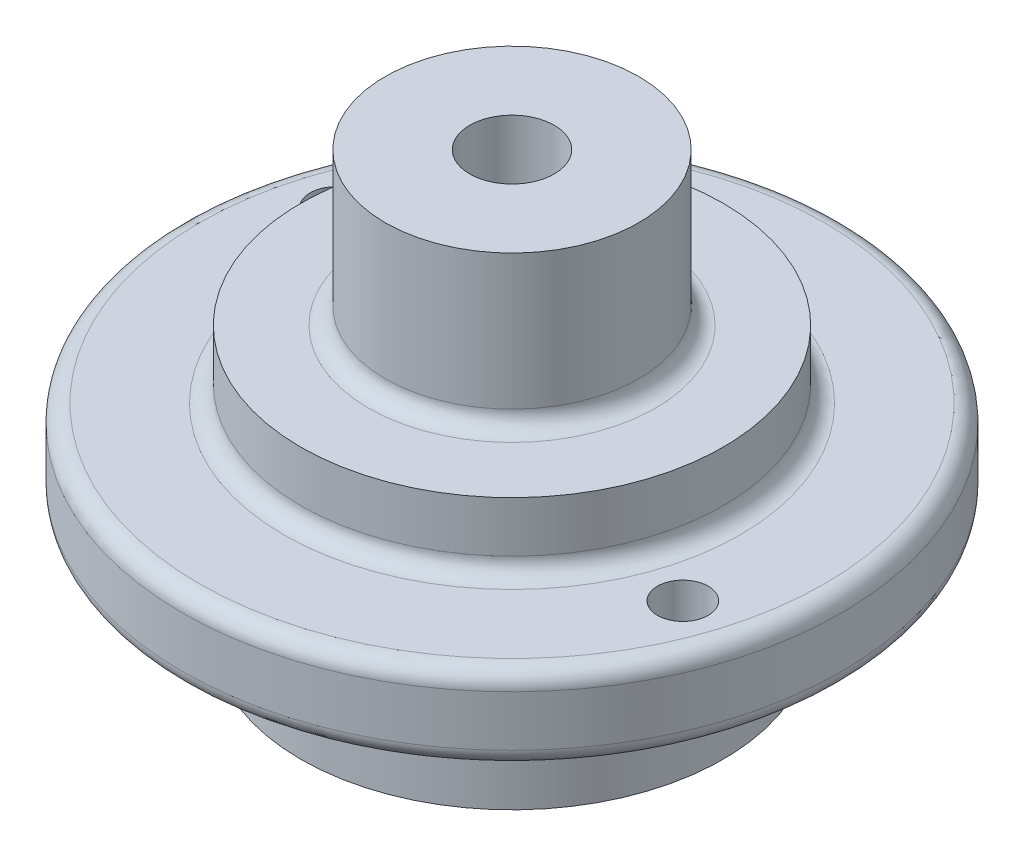
ISO-10303-21;
HEADER;
FILE_DESCRIPTION(('STEP AP214'),'2;1');
FILE_NAME('part.step','',(''),(''),'','','');
FILE_SCHEMA(('AUTOMOTIVE_DESIGN { 1 0 10303 214 1 1 1 1 }'));
ENDSEC;
DATA;
#1=APPLICATION_CONTEXT('core data for automotive mechanical design processes');
#2=APPLICATION_PROTOCOL_DEFINITION('international standard','automotive_design',2000,#1);
#3=PRODUCT_CONTEXT('',#1,'mechanical');
#4=PRODUCT('Part','Part','',(#3));
#5=PRODUCT_RELATED_PRODUCT_CATEGORY('part','',(#4));
#6=PRODUCT_DEFINITION_FORMATION('','',#4);
#7=PRODUCT_DEFINITION_CONTEXT('part definition',#1,'design');
#8=PRODUCT_DEFINITION('design','',#6,#7);
#9=PRODUCT_DEFINITION_SHAPE('','',#8);
#10=(LENGTH_UNIT() NAMED_UNIT(*) SI_UNIT(.MILLI.,.METRE.));
#11=(NAMED_UNIT(*) PLANE_ANGLE_UNIT() SI_UNIT($,.RADIAN.));
#12=(NAMED_UNIT(*) SI_UNIT($,.STERADIAN.) SOLID_ANGLE_UNIT());
#13=UNCERTAINTY_MEASURE_WITH_UNIT(LENGTH_MEASURE(1.E-05),#10,'distance_accuracy_value','');
#14=(GEOMETRIC_REPRESENTATION_CONTEXT(3) GLOBAL_UNCERTAINTY_ASSIGNED_CONTEXT((#13)) GLOBAL_UNIT_ASSIGNED_CONTEXT((#10,
#11,#12)) REPRESENTATION_CONTEXT('',''));
#15=CARTESIAN_POINT('',(0.,0.,0.));
#16=DIRECTION('',(0.,0.,1.));
#17=DIRECTION('',(1.,0.,0.));
#18=AXIS2_PLACEMENT_3D('',#15,#16,#17);
#19=CARTESIAN_POINT('',(0.,43.2272727272726,7.5));
#20=DIRECTION('',(0.,1.,0.));
#21=DIRECTION('',(0.,0.,1.));
#22=AXIS2_PLACEMENT_3D('',#19,#20,#21);
#23=PLANE('',#22);
#24=CARTESIAN_POINT('',(0.,43.2272727272726,0.));
#25=DIRECTION('',(0.,1.,0.));
#26=DIRECTION('',(0.,0.,1.));
#27=AXIS2_PLACEMENT_3D('',#24,#25,#26);
#28=CIRCLE('',#27,7.5);
#29=CARTESIAN_POINT('',(0.,43.2272727272726,7.5));
#30=VERTEX_POINT('',#29);
#31=EDGE_CURVE('E96',#30,#30,#28,.T.);
#32=ORIENTED_EDGE('',*,*,#31,.T.);
#33=EDGE_LOOP('',(#32));
#34=FACE_BOUND('',#33,.T.);
#35=CARTESIAN_POINT('',(0.,43.2272727272726,0.));
#36=DIRECTION('',(0.,1.,0.));
#37=DIRECTION('',(0.,0.,1.));
#38=AXIS2_PLACEMENT_3D('',#35,#36,#37);
#39=CIRCLE('',#38,2.5);
#40=CARTESIAN_POINT('',(0.,43.2272727272726,2.5));
#41=VERTEX_POINT('',#40);
#42=EDGE_CURVE('E69',#41,#41,#39,.T.);
#43=ORIENTED_EDGE('',*,*,#42,.F.);
#44=EDGE_LOOP('',(#43));
#45=FACE_BOUND('',#44,.T.);
#46=ADVANCED_FACE('F37',(#34,#45),#23,.T.);
#47=CARTESIAN_POINT('',(0.,55.4545454545453,0.));
#48=DIRECTION('',(0.,1.,0.));
#49=DIRECTION('',(0.,0.,1.));
#50=AXIS2_PLACEMENT_3D('',#47,#48,#49);
#51=CYLINDRICAL_SURFACE('',#50,2.5);
#52=ORIENTED_EDGE('',*,*,#42,.T.);
#53=EDGE_LOOP('',(#52));
#54=FACE_BOUND('',#53,.T.);
#55=CARTESIAN_POINT('',(0.,36.2272727272726,0.));
#56=DIRECTION('',(0.,1.,0.));
#57=DIRECTION('',(0.,0.,1.));
#58=AXIS2_PLACEMENT_3D('',#55,#56,#57);
#59=CIRCLE('',#58,2.5);
#60=CARTESIAN_POINT('',(0.,36.2272727272726,2.5));
#61=VERTEX_POINT('',#60);
#62=EDGE_CURVE('E72',#61,#61,#59,.T.);
#63=ORIENTED_EDGE('',*,*,#62,.F.);
#64=EDGE_LOOP('',(#63));
#65=FACE_BOUND('',#64,.T.);
#66=ADVANCED_FACE('F147',(#54,#65),#51,.F.);
#67=CARTESIAN_POINT('',(0.,36.2272727272726,2.5));
#68=DIRECTION('',(0.,-1.,0.));
#69=DIRECTION('',(0.,0.,-1.));
#70=AXIS2_PLACEMENT_3D('',#67,#68,#69);
#71=PLANE('',#70);
#72=ORIENTED_EDGE('',*,*,#62,.T.);
#73=EDGE_LOOP('',(#72));
#74=FACE_BOUND('',#73,.T.);
#75=CARTESIAN_POINT('',(0.,36.2272727272726,0.));
#76=DIRECTION('',(0.,1.,0.));
#77=DIRECTION('',(0.,0.,1.));
#78=AXIS2_PLACEMENT_3D('',#75,#76,#77);
#79=CIRCLE('',#78,5.);
#80=CARTESIAN_POINT('',(0.,36.2272727272726,5.));
#81=VERTEX_POINT('',#80);
#82=EDGE_CURVE('E75',#81,#81,#79,.T.);
#83=ORIENTED_EDGE('',*,*,#82,.F.);
#84=EDGE_LOOP('',(#83));
#85=FACE_BOUND('',#84,.T.);
#86=ADVANCED_FACE('F153',(#74,#85),#71,.T.);
#87=CARTESIAN_POINT('',(0.,55.4545454545453,0.));
#88=DIRECTION('',(0.,1.,0.));
#89=DIRECTION('',(0.,0.,1.));
#90=AXIS2_PLACEMENT_3D('',#87,#88,#89);
#91=CYLINDRICAL_SURFACE('',#90,5.);
#92=ORIENTED_EDGE('',*,*,#82,.T.);
#93=EDGE_LOOP('',(#92));
#94=FACE_BOUND('',#93,.T.);
#95=CARTESIAN_POINT('',(0.,30.2272727272726,0.));
#96=DIRECTION('',(0.,1.,0.));
#97=DIRECTION('',(0.,0.,1.));
#98=AXIS2_PLACEMENT_3D('',#95,#96,#97);
#99=CIRCLE('',#98,5.);
#100=CARTESIAN_POINT('',(0.,30.2272727272726,5.));
#101=VERTEX_POINT('',#100);
#102=EDGE_CURVE('E78',#101,#101,#99,.T.);
#103=ORIENTED_EDGE('',*,*,#102,.F.);
#104=EDGE_LOOP('',(#103));
#105=FACE_BOUND('',#104,.T.);
#106=ADVANCED_FACE('F199',(#94,#105),#91,.F.);
#107=CARTESIAN_POINT('',(0.,30.2272727272726,5.));
#108=DIRECTION('',(0.,-1.,0.));
#109=DIRECTION('',(0.,0.,-1.));
#110=AXIS2_PLACEMENT_3D('',#107,#108,#109);
#111=PLANE('',#110);
#112=ORIENTED_EDGE('',*,*,#102,.T.);
#113=EDGE_LOOP('',(#112));
#114=FACE_BOUND('',#113,.T.);
#115=CARTESIAN_POINT('',(0.,30.2272727272726,0.));
#116=DIRECTION('',(0.,1.,0.));
#117=DIRECTION('',(0.,0.,1.));
#118=AXIS2_PLACEMENT_3D('',#115,#116,#117);
#119=CIRCLE('',#118,8.25);
#120=CARTESIAN_POINT('',(0.,30.2272727272726,8.25));
#121=VERTEX_POINT('',#120);
#122=EDGE_CURVE('E81',#121,#121,#119,.T.);
#123=ORIENTED_EDGE('',*,*,#122,.F.);
#124=EDGE_LOOP('',(#123));
#125=FACE_BOUND('',#124,.T.);
#126=ADVANCED_FACE('F195',(#114,#125),#111,.T.);
#127=CARTESIAN_POINT('',(0.,55.4545454545453,0.));
#128=DIRECTION('',(0.,1.,0.));
#129=DIRECTION('',(0.,0.,1.));
#130=AXIS2_PLACEMENT_3D('',#127,#128,#129);
#131=CYLINDRICAL_SURFACE('',#130,8.25);
#132=ORIENTED_EDGE('',*,*,#122,.T.);
#133=EDGE_LOOP('',(#132));
#134=FACE_BOUND('',#133,.T.);
#135=CARTESIAN_POINT('',(0.,18.2272727272726,0.));
#136=DIRECTION('',(0.,1.,0.));
#137=DIRECTION('',(0.,0.,1.));
#138=AXIS2_PLACEMENT_3D('',#135,#136,#137);
#139=CIRCLE('',#138,8.24999999999999);
#140=CARTESIAN_POINT('',(0.,18.2272727272726,8.24999999999999));
#141=VERTEX_POINT('',#140);
#142=EDGE_CURVE('E84',#141,#141,#139,.T.);
#143=ORIENTED_EDGE('',*,*,#142,.F.);
#144=EDGE_LOOP('',(#143));
#145=FACE_BOUND('',#144,.T.);
#146=ADVANCED_FACE('F191',(#134,#145),#131,.F.);
#147=CARTESIAN_POINT('',(0.,18.2272727272726,8.24999999999999));
#148=DIRECTION('',(0.,-1.,0.));
#149=DIRECTION('',(0.,0.,-1.));
#150=AXIS2_PLACEMENT_3D('',#147,#148,#149);
#151=PLANE('',#150);
#152=ORIENTED_EDGE('',*,*,#142,.T.);
#153=EDGE_LOOP('',(#152));
#154=FACE_BOUND('',#153,.T.);
#155=CARTESIAN_POINT('',(0.,18.2272727272726,0.));
#156=DIRECTION('',(0.,1.,0.));
#157=DIRECTION('',(0.,0.,1.));
#158=AXIS2_PLACEMENT_3D('',#155,#156,#157);
#159=CIRCLE('',#158,12.5);
#160=CARTESIAN_POINT('',(0.,18.2272727272726,12.5));
#161=VERTEX_POINT('',#160);
#162=EDGE_CURVE('E87',#161,#161,#159,.T.);
#163=ORIENTED_EDGE('',*,*,#162,.F.);
#164=EDGE_LOOP('',(#163));
#165=FACE_BOUND('',#164,.T.);
#166=ADVANCED_FACE('F187',(#154,#165),#151,.T.);
#167=CARTESIAN_POINT('',(0.,55.4545454545453,0.));
#168=DIRECTION('',(0.,1.,0.));
#169=DIRECTION('',(0.,0.,1.));
#170=AXIS2_PLACEMENT_3D('',#167,#168,#169);
#171=CYLINDRICAL_SURFACE('',#170,12.5);
#172=ORIENTED_EDGE('',*,*,#162,.T.);
#173=EDGE_LOOP('',(#172));
#174=FACE_BOUND('',#173,.T.);
#175=CARTESIAN_POINT('',(0.,25.2272727272726,0.));
#176=DIRECTION('',(0.,1.,0.));
#177=DIRECTION('',(0.,0.,1.));
#178=AXIS2_PLACEMENT_3D('',#175,#176,#177);
#179=CIRCLE('',#178,12.5);
#180=CARTESIAN_POINT('',(0.,25.2272727272726,12.5));
#181=VERTEX_POINT('',#180);
#182=EDGE_CURVE('E90',#181,#181,#179,.T.);
#183=ORIENTED_EDGE('',*,*,#182,.F.);
#184=EDGE_LOOP('',(#183));
#185=FACE_BOUND('',#184,.T.);
#186=ADVANCED_FACE('F181',(#174,#185),#171,.T.);
#187=CARTESIAN_POINT('',(0.,25.2272727272726,12.5));
#188=DIRECTION('',(0.,-1.,0.));
#189=DIRECTION('',(0.,0.,-1.));
#190=AXIS2_PLACEMENT_3D('',#187,#188,#189);
#191=PLANE('',#190);
#192=CARTESIAN_POINT('',(15.176066715795,25.2272727272726,5.06823431164532));
#193=DIRECTION('',(0.,-1.,0.));
#194=DIRECTION('',(0.,0.,-1.));
#195=AXIS2_PLACEMENT_3D('',#192,#193,#194);
#196=CIRCLE('',#195,1.50000000001293);
#197=CARTESIAN_POINT('',(15.176066715795,25.2272727272726,3.56823431163239));
#198=VERTEX_POINT('',#197);
#199=EDGE_CURVE('E99',#198,#198,#196,.T.);
#200=ORIENTED_EDGE('',*,*,#199,.F.);
#201=EDGE_LOOP('',(#200));
#202=FACE_BOUND('',#201,.T.);
#203=CARTESIAN_POINT('',(-15.2583110643974,25.2272727272726,-4.81497076440627));
#204=DIRECTION('',(0.,-1.,0.));
#205=DIRECTION('',(0.,0.,-1.));
#206=AXIS2_PLACEMENT_3D('',#203,#204,#205);
#207=CIRCLE('',#206,1.50000000001262);
#208=CARTESIAN_POINT('',(-15.2583110643974,25.2272727272726,-6.31497076441889));
#209=VERTEX_POINT('',#208);
#210=EDGE_CURVE('E102',#209,#209,#207,.T.);
#211=ORIENTED_EDGE('',*,*,#210,.F.);
#212=EDGE_LOOP('',(#211));
#213=FACE_BOUND('',#212,.T.);
#214=CARTESIAN_POINT('',(0.,25.2272727272726,0.));
#215=DIRECTION('',(0.,-1.,0.));
#216=DIRECTION('',(0.,0.,-1.));
#217=AXIS2_PLACEMENT_3D('',#214,#215,#216);
#218=CIRCLE('',#217,18.5);
#219=CARTESIAN_POINT('',(0.,25.2272727272726,-18.5));
#220=VERTEX_POINT('',#219);
#221=EDGE_CURVE('E44',#220,#220,#218,.T.);
#222=ORIENTED_EDGE('',*,*,#221,.T.);
#223=EDGE_LOOP('',(#222));
#224=FACE_BOUND('',#223,.T.);
#225=ORIENTED_EDGE('',*,*,#182,.T.);
#226=EDGE_LOOP('',(#225));
#227=FACE_BOUND('',#226,.T.);
#228=ADVANCED_FACE('F174',(#202,#213,#224,#227),#191,.T.);
#229=CARTESIAN_POINT('',(0.,55.4545454545453,0.));
#230=DIRECTION('',(0.,1.,0.));
#231=DIRECTION('',(0.,0.,1.));
#232=AXIS2_PLACEMENT_3D('',#229,#230,#231);
#233=CYLINDRICAL_SURFACE('',#232,19.5);
#234=CARTESIAN_POINT('',(0.,26.2272727272726,0.));
#235=DIRECTION('',(0.,-1.,0.));
#236=DIRECTION('',(0.,0.,-1.));
#237=AXIS2_PLACEMENT_3D('',#234,#235,#236);
#238=CIRCLE('',#237,19.5);
#239=CARTESIAN_POINT('',(0.,26.2272727272726,-19.5));
#240=VERTEX_POINT('',#239);
#241=EDGE_CURVE('E48',#240,#240,#238,.F.);
#242=ORIENTED_EDGE('',*,*,#241,.T.);
#243=EDGE_LOOP('',(#242));
#244=FACE_BOUND('',#243,.T.);
#245=CARTESIAN_POINT('',(0.,29.2272727272726,0.));
#246=DIRECTION('',(0.,1.,0.));
#247=DIRECTION('',(0.,0.,1.));
#248=AXIS2_PLACEMENT_3D('',#245,#246,#247);
#249=CIRCLE('',#248,19.5);
#250=CARTESIAN_POINT('',(0.,29.2272727272726,19.5));
#251=VERTEX_POINT('',#250);
#252=EDGE_CURVE('E52',#251,#251,#249,.F.);
#253=ORIENTED_EDGE('',*,*,#252,.T.);
#254=EDGE_LOOP('',(#253));
#255=FACE_BOUND('',#254,.T.);
#256=ADVANCED_FACE('F118',(#244,#255),#233,.T.);
#257=CARTESIAN_POINT('',(0.,30.2272727272726,19.5));
#258=DIRECTION('',(0.,1.,0.));
#259=DIRECTION('',(0.,0.,1.));
#260=AXIS2_PLACEMENT_3D('',#257,#258,#259);
#261=PLANE('',#260);
#262=CARTESIAN_POINT('',(15.176066715795,30.2272727272726,5.06823431164532));
#263=DIRECTION('',(0.,1.,0.));
#264=DIRECTION('',(0.,0.,1.));
#265=AXIS2_PLACEMENT_3D('',#262,#263,#264);
#266=CIRCLE('',#265,1.50000000001293);
#267=CARTESIAN_POINT('',(15.176066715795,30.2272727272726,6.56823431165825));
#268=VERTEX_POINT('',#267);
#269=EDGE_CURVE('E105',#268,#268,#266,.T.);
#270=ORIENTED_EDGE('',*,*,#269,.F.);
#271=EDGE_LOOP('',(#270));
#272=FACE_BOUND('',#271,.T.);
#273=CARTESIAN_POINT('',(-15.2583110643974,30.2272727272726,-4.81497076440627));
#274=DIRECTION('',(0.,1.,0.));
#275=DIRECTION('',(0.,0.,1.));
#276=AXIS2_PLACEMENT_3D('',#273,#274,#275);
#277=CIRCLE('',#276,1.50000000001262);
#278=CARTESIAN_POINT('',(-15.2583110643974,30.2272727272726,-3.31497076439365));
#279=VERTEX_POINT('',#278);
#280=EDGE_CURVE('E106',#279,#279,#277,.T.);
#281=ORIENTED_EDGE('',*,*,#280,.F.);
#282=EDGE_LOOP('',(#281));
#283=FACE_BOUND('',#282,.T.);
#284=CARTESIAN_POINT('',(0.,30.2272727272726,0.));
#285=DIRECTION('',(0.,1.,0.));
#286=DIRECTION('',(0.,0.,1.));
#287=AXIS2_PLACEMENT_3D('',#284,#285,#286);
#288=CIRCLE('',#287,18.5);
#289=CARTESIAN_POINT('',(0.,30.2272727272726,18.5));
#290=VERTEX_POINT('',#289);
#291=EDGE_CURVE('E10',#290,#290,#288,.T.);
#292=ORIENTED_EDGE('',*,*,#291,.T.);
#293=EDGE_LOOP('',(#292));
#294=FACE_BOUND('',#293,.T.);
#295=CARTESIAN_POINT('',(0.,30.2272727272726,0.));
#296=DIRECTION('',(0.,1.,0.));
#297=DIRECTION('',(0.,0.,1.));
#298=AXIS2_PLACEMENT_3D('',#295,#296,#297);
#299=CIRCLE('',#298,13.5);
#300=CARTESIAN_POINT('',(0.,30.2272727272726,13.5));
#301=VERTEX_POINT('',#300);
#302=EDGE_CURVE('E63',#301,#301,#299,.F.);
#303=ORIENTED_EDGE('',*,*,#302,.T.);
#304=EDGE_LOOP('',(#303));
#305=FACE_BOUND('',#304,.T.);
#306=ADVANCED_FACE('F114',(#272,#283,#294,#305),#261,.T.);
#307=CARTESIAN_POINT('',(0.,55.4545454545453,0.));
#308=DIRECTION('',(0.,1.,0.));
#309=DIRECTION('',(0.,0.,1.));
#310=AXIS2_PLACEMENT_3D('',#307,#308,#309);
#311=CYLINDRICAL_SURFACE('',#310,12.5);
#312=CARTESIAN_POINT('',(0.,31.2272727272726,0.));
#313=DIRECTION('',(0.,1.,0.));
#314=DIRECTION('',(0.,0.,1.));
#315=AXIS2_PLACEMENT_3D('',#312,#313,#314);
#316=CIRCLE('',#315,12.5);
#317=CARTESIAN_POINT('',(0.,31.2272727272726,12.5));
#318=VERTEX_POINT('',#317);
#319=EDGE_CURVE('E66',#318,#318,#316,.T.);
#320=ORIENTED_EDGE('',*,*,#319,.T.);
#321=EDGE_LOOP('',(#320));
#322=FACE_BOUND('',#321,.T.);
#323=CARTESIAN_POINT('',(0.,34.2272727272726,0.));
#324=DIRECTION('',(0.,1.,0.));
#325=DIRECTION('',(0.,0.,1.));
#326=AXIS2_PLACEMENT_3D('',#323,#324,#325);
#327=CIRCLE('',#326,12.5);
#328=CARTESIAN_POINT('',(0.,34.2272727272726,12.5));
#329=VERTEX_POINT('',#328);
#330=EDGE_CURVE('E93',#329,#329,#327,.T.);
#331=ORIENTED_EDGE('',*,*,#330,.F.);
#332=EDGE_LOOP('',(#331));
#333=FACE_BOUND('',#332,.T.);
#334=ADVANCED_FACE('F117',(#322,#333),#311,.T.);
#335=CARTESIAN_POINT('',(0.,34.2272727272726,12.5));
#336=DIRECTION('',(0.,1.,0.));
#337=DIRECTION('',(0.,0.,1.));
#338=AXIS2_PLACEMENT_3D('',#335,#336,#337);
#339=PLANE('',#338);
#340=CARTESIAN_POINT('',(0.,34.2272727272726,0.));
#341=DIRECTION('',(0.,1.,0.));
#342=DIRECTION('',(0.,0.,1.));
#343=AXIS2_PLACEMENT_3D('',#340,#341,#342);
#344=CIRCLE('',#343,8.5);
#345=CARTESIAN_POINT('',(0.,34.2272727272726,8.5));
#346=VERTEX_POINT('',#345);
#347=EDGE_CURVE('E57',#346,#346,#344,.F.);
#348=ORIENTED_EDGE('',*,*,#347,.T.);
#349=EDGE_LOOP('',(#348));
#350=FACE_BOUND('',#349,.T.);
#351=ORIENTED_EDGE('',*,*,#330,.T.);
#352=EDGE_LOOP('',(#351));
#353=FACE_BOUND('',#352,.T.);
#354=ADVANCED_FACE('F134',(#350,#353),#339,.T.);
#355=CARTESIAN_POINT('',(0.,55.4545454545453,0.));
#356=DIRECTION('',(0.,1.,0.));
#357=DIRECTION('',(0.,0.,1.));
#358=AXIS2_PLACEMENT_3D('',#355,#356,#357);
#359=CYLINDRICAL_SURFACE('',#358,7.5);
#360=CARTESIAN_POINT('',(0.,35.2272727272726,0.));
#361=DIRECTION('',(0.,1.,0.));
#362=DIRECTION('',(0.,0.,1.));
#363=AXIS2_PLACEMENT_3D('',#360,#361,#362);
#364=CIRCLE('',#363,7.5);
#365=CARTESIAN_POINT('',(0.,35.2272727272726,7.5));
#366=VERTEX_POINT('',#365);
#367=EDGE_CURVE('E60',#366,#366,#364,.T.);
#368=ORIENTED_EDGE('',*,*,#367,.T.);
#369=EDGE_LOOP('',(#368));
#370=FACE_BOUND('',#369,.T.);
#371=ORIENTED_EDGE('',*,*,#31,.F.);
#372=EDGE_LOOP('',(#371));
#373=FACE_BOUND('',#372,.T.);
#374=ADVANCED_FACE('F128',(#370,#373),#359,.T.);
#375=CARTESIAN_POINT('',(0.,31.2272727272726,0.));
#376=DIRECTION('',(0.,1.,0.));
#377=DIRECTION('',(0.,0.,1.));
#378=AXIS2_PLACEMENT_3D('',#375,#376,#377);
#379=TOROIDAL_SURFACE('',#378,13.5,1.);
#380=ORIENTED_EDGE('',*,*,#302,.F.);
#381=EDGE_LOOP('',(#380));
#382=FACE_BOUND('',#381,.T.);
#383=ORIENTED_EDGE('',*,*,#319,.F.);
#384=EDGE_LOOP('',(#383));
#385=FACE_BOUND('',#384,.T.);
#386=ADVANCED_FACE('F124',(#382,#385),#379,.F.);
#387=CARTESIAN_POINT('',(0.,35.2272727272726,0.));
#388=DIRECTION('',(0.,1.,0.));
#389=DIRECTION('',(0.,0.,1.));
#390=AXIS2_PLACEMENT_3D('',#387,#388,#389);
#391=TOROIDAL_SURFACE('',#390,8.5,1.);
#392=ORIENTED_EDGE('',*,*,#347,.F.);
#393=EDGE_LOOP('',(#392));
#394=FACE_BOUND('',#393,.T.);
#395=ORIENTED_EDGE('',*,*,#367,.F.);
#396=EDGE_LOOP('',(#395));
#397=FACE_BOUND('',#396,.T.);
#398=ADVANCED_FACE('F127',(#394,#397),#391,.F.);
#399=CARTESIAN_POINT('',(0.,26.2272727272726,0.));
#400=DIRECTION('',(0.,-1.,0.));
#401=DIRECTION('',(0.,0.,-1.));
#402=AXIS2_PLACEMENT_3D('',#399,#400,#401);
#403=TOROIDAL_SURFACE('',#402,18.5,1.);
#404=ORIENTED_EDGE('',*,*,#221,.F.);
#405=EDGE_LOOP('',(#404));
#406=FACE_BOUND('',#405,.T.);
#407=ORIENTED_EDGE('',*,*,#241,.F.);
#408=EDGE_LOOP('',(#407));
#409=FACE_BOUND('',#408,.T.);
#410=ADVANCED_FACE('F160',(#406,#409),#403,.T.);
#411=CARTESIAN_POINT('',(0.,29.2272727272726,0.));
#412=DIRECTION('',(0.,1.,0.));
#413=DIRECTION('',(0.,0.,1.));
#414=AXIS2_PLACEMENT_3D('',#411,#412,#413);
#415=TOROIDAL_SURFACE('',#414,18.5,1.);
#416=ORIENTED_EDGE('',*,*,#252,.F.);
#417=EDGE_LOOP('',(#416));
#418=FACE_BOUND('',#417,.T.);
#419=ORIENTED_EDGE('',*,*,#291,.F.);
#420=EDGE_LOOP('',(#419));
#421=FACE_BOUND('',#420,.T.);
#422=ADVANCED_FACE('F39',(#418,#421),#415,.T.);
#423=CARTESIAN_POINT('',(-15.2583110643974,10.2272727272726,-4.81497076440627));
#424=DIRECTION('',(0.,1.,0.));
#425=DIRECTION('',(0.,0.,1.));
#426=AXIS2_PLACEMENT_3D('',#423,#424,#425);
#427=CYLINDRICAL_SURFACE('',#426,1.50000000001262);
#428=ORIENTED_EDGE('',*,*,#210,.T.);
#429=EDGE_LOOP('',(#428));
#430=FACE_BOUND('',#429,.T.);
#431=ORIENTED_EDGE('',*,*,#280,.T.);
#432=EDGE_LOOP('',(#431));
#433=FACE_BOUND('',#432,.T.);
#434=ADVANCED_FACE('F167',(#430,#433),#427,.F.);
#435=CARTESIAN_POINT('',(15.176066715795,10.2272727272726,5.06823431164532));
#436=DIRECTION('',(0.,1.,0.));
#437=DIRECTION('',(0.,0.,1.));
#438=AXIS2_PLACEMENT_3D('',#435,#436,#437);
#439=CYLINDRICAL_SURFACE('',#438,1.50000000001293);
#440=ORIENTED_EDGE('',*,*,#199,.T.);
#441=EDGE_LOOP('',(#440));
#442=FACE_BOUND('',#441,.T.);
#443=ORIENTED_EDGE('',*,*,#269,.T.);
#444=EDGE_LOOP('',(#443));
#445=FACE_BOUND('',#444,.T.);
#446=ADVANCED_FACE('F112',(#442,#445),#439,.F.);
#447=CLOSED_SHELL('',(#46,#66,#86,#106,#126,#146,#166,#186,#228,#256,#306,#334,#354,#374,#386,
#398,#410,#422,#434,#446));
#448=MANIFOLD_SOLID_BREP('B2',#447);
#449=ADVANCED_BREP_SHAPE_REPRESENTATION('',(#18,#448),#14);
#450=SHAPE_DEFINITION_REPRESENTATION(#9,#449);
ENDSEC;
END-ISO-10303-21;
